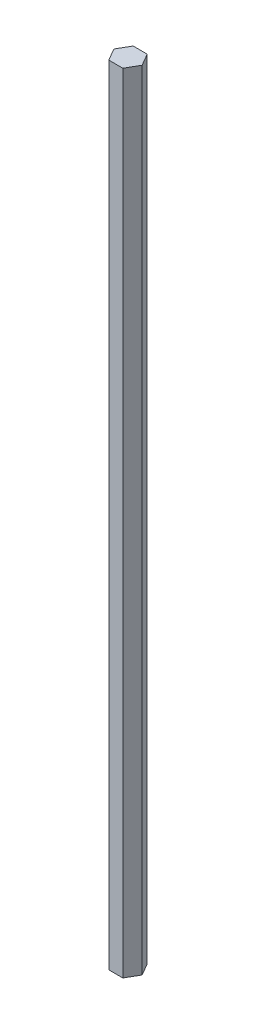
ISO-10303-21;
HEADER;
FILE_DESCRIPTION(('STEP AP214'),'2;1');
FILE_NAME('part.step','',(''),(''),'','','');
FILE_SCHEMA(('AUTOMOTIVE_DESIGN { 1 0 10303 214 1 1 1 1 }'));
ENDSEC;
DATA;
#1=APPLICATION_CONTEXT('core data for automotive mechanical design processes');
#2=APPLICATION_PROTOCOL_DEFINITION('international standard','automotive_design',2000,#1);
#3=PRODUCT_CONTEXT('',#1,'mechanical');
#4=PRODUCT('Part','Part','',(#3));
#5=PRODUCT_RELATED_PRODUCT_CATEGORY('part','',(#4));
#6=PRODUCT_DEFINITION_FORMATION('','',#4);
#7=PRODUCT_DEFINITION_CONTEXT('part definition',#1,'design');
#8=PRODUCT_DEFINITION('design','',#6,#7);
#9=PRODUCT_DEFINITION_SHAPE('','',#8);
#10=(LENGTH_UNIT() NAMED_UNIT(*) SI_UNIT(.MILLI.,.METRE.));
#11=(NAMED_UNIT(*) PLANE_ANGLE_UNIT() SI_UNIT($,.RADIAN.));
#12=(NAMED_UNIT(*) SI_UNIT($,.STERADIAN.) SOLID_ANGLE_UNIT());
#13=UNCERTAINTY_MEASURE_WITH_UNIT(LENGTH_MEASURE(1.E-05),#10,'distance_accuracy_value','');
#14=(GEOMETRIC_REPRESENTATION_CONTEXT(3) GLOBAL_UNCERTAINTY_ASSIGNED_CONTEXT((#13)) GLOBAL_UNIT_ASSIGNED_CONTEXT((#10,
#11,#12)) REPRESENTATION_CONTEXT('',''));
#15=CARTESIAN_POINT('',(0.,0.,0.));
#16=DIRECTION('',(0.,0.,1.));
#17=DIRECTION('',(1.,0.,0.));
#18=AXIS2_PLACEMENT_3D('',#15,#16,#17);
#19=CARTESIAN_POINT('',(-3.66617420935412,410.464,6.35));
#20=DIRECTION('',(0.,0.,-1.));
#21=DIRECTION('',(-1.,0.,0.));
#22=AXIS2_PLACEMENT_3D('',#19,#20,#21);
#23=PLANE('',#22);
#24=DIRECTION('',(1.,0.,0.));
#25=VECTOR('',#24,1.);
#26=CARTESIAN_POINT('',(-3.66617420935412,0.,6.35));
#27=LINE('',#26,#25);
#28=CARTESIAN_POINT('',(-3.66617420935412,0.,6.35));
#29=VERTEX_POINT('',#28);
#30=CARTESIAN_POINT('',(3.66617420935412,0.,6.35));
#31=VERTEX_POINT('',#30);
#32=EDGE_CURVE('E130',#29,#31,#27,.T.);
#33=ORIENTED_EDGE('',*,*,#32,.T.);
#34=DIRECTION('',(0.,-1.,0.));
#35=VECTOR('',#34,1.);
#36=CARTESIAN_POINT('',(3.66617420935412,410.464,6.35));
#37=LINE('',#36,#35);
#38=CARTESIAN_POINT('',(3.66617420935412,410.464,6.35));
#39=VERTEX_POINT('',#38);
#40=EDGE_CURVE('E11',#39,#31,#37,.T.);
#41=ORIENTED_EDGE('',*,*,#40,.F.);
#42=DIRECTION('',(1.,0.,0.));
#43=VECTOR('',#42,1.);
#44=CARTESIAN_POINT('',(-3.66617420935412,410.464,6.35));
#45=LINE('',#44,#43);
#46=CARTESIAN_POINT('',(-3.66617420935412,410.464,6.35));
#47=VERTEX_POINT('',#46);
#48=EDGE_CURVE('E142',#47,#39,#45,.T.);
#49=ORIENTED_EDGE('',*,*,#48,.F.);
#50=DIRECTION('',(0.,-1.,0.));
#51=VECTOR('',#50,1.);
#52=CARTESIAN_POINT('',(-3.66617420935412,410.464,6.35));
#53=LINE('',#52,#51);
#54=EDGE_CURVE('E126',#47,#29,#53,.T.);
#55=ORIENTED_EDGE('',*,*,#54,.T.);
#56=EDGE_LOOP('',(#33,#41,#49,#55));
#57=FACE_BOUND('',#56,.T.);
#58=ADVANCED_FACE('F43',(#57),#23,.F.);
#59=CARTESIAN_POINT('',(3.66617420935412,410.464,6.35));
#60=DIRECTION('',(-0.866025403784439,0.,-0.5));
#61=DIRECTION('',(-0.5,0.,0.866025403784439));
#62=AXIS2_PLACEMENT_3D('',#59,#60,#61);
#63=PLANE('',#62);
#64=DIRECTION('',(0.5,0.,-0.866025403784439));
#65=VECTOR('',#64,1.);
#66=CARTESIAN_POINT('',(3.66617420935412,0.,6.35));
#67=LINE('',#66,#65);
#68=CARTESIAN_POINT('',(7.33234841870825,0.,0.));
#69=VERTEX_POINT('',#68);
#70=EDGE_CURVE('E133',#31,#69,#67,.T.);
#71=ORIENTED_EDGE('',*,*,#70,.T.);
#72=DIRECTION('',(0.,-1.,0.));
#73=VECTOR('',#72,1.);
#74=CARTESIAN_POINT('',(7.33234841870825,410.464,0.));
#75=LINE('',#74,#73);
#76=CARTESIAN_POINT('',(7.33234841870825,410.464,0.));
#77=VERTEX_POINT('',#76);
#78=EDGE_CURVE('E52',#77,#69,#75,.T.);
#79=ORIENTED_EDGE('',*,*,#78,.F.);
#80=DIRECTION('',(0.5,0.,-0.866025403784439));
#81=VECTOR('',#80,1.);
#82=CARTESIAN_POINT('',(3.66617420935412,410.464,6.35));
#83=LINE('',#82,#81);
#84=EDGE_CURVE('E98',#39,#77,#83,.T.);
#85=ORIENTED_EDGE('',*,*,#84,.F.);
#86=ORIENTED_EDGE('',*,*,#40,.T.);
#87=EDGE_LOOP('',(#71,#79,#85,#86));
#88=FACE_BOUND('',#87,.T.);
#89=ADVANCED_FACE('F170',(#88),#63,.F.);
#90=CARTESIAN_POINT('',(7.33234841870825,410.464,0.));
#91=DIRECTION('',(-0.866025403784439,0.,0.5));
#92=DIRECTION('',(0.5,0.,0.866025403784439));
#93=AXIS2_PLACEMENT_3D('',#90,#91,#92);
#94=PLANE('',#93);
#95=DIRECTION('',(-0.5,0.,-0.866025403784438));
#96=VECTOR('',#95,1.);
#97=CARTESIAN_POINT('',(7.33234841870825,0.,0.));
#98=LINE('',#97,#96);
#99=CARTESIAN_POINT('',(3.66617420935412,0.,-6.35));
#100=VERTEX_POINT('',#99);
#101=EDGE_CURVE('E135',#69,#100,#98,.T.);
#102=ORIENTED_EDGE('',*,*,#101,.T.);
#103=DIRECTION('',(0.,-1.,0.));
#104=VECTOR('',#103,1.);
#105=CARTESIAN_POINT('',(3.66617420935412,410.464,-6.35));
#106=LINE('',#105,#104);
#107=CARTESIAN_POINT('',(3.66617420935412,410.464,-6.35));
#108=VERTEX_POINT('',#107);
#109=EDGE_CURVE('E121',#108,#100,#106,.T.);
#110=ORIENTED_EDGE('',*,*,#109,.F.);
#111=DIRECTION('',(-0.5,0.,-0.866025403784438));
#112=VECTOR('',#111,1.);
#113=CARTESIAN_POINT('',(7.33234841870825,410.464,0.));
#114=LINE('',#113,#112);
#115=EDGE_CURVE('E111',#77,#108,#114,.T.);
#116=ORIENTED_EDGE('',*,*,#115,.F.);
#117=ORIENTED_EDGE('',*,*,#78,.T.);
#118=EDGE_LOOP('',(#102,#110,#116,#117));
#119=FACE_BOUND('',#118,.T.);
#120=ADVANCED_FACE('F152',(#119),#94,.F.);
#121=CARTESIAN_POINT('',(3.66617420935412,410.464,-6.35));
#122=DIRECTION('',(0.,0.,1.));
#123=DIRECTION('',(1.,0.,0.));
#124=AXIS2_PLACEMENT_3D('',#121,#122,#123);
#125=PLANE('',#124);
#126=DIRECTION('',(-1.,0.,0.));
#127=VECTOR('',#126,1.);
#128=CARTESIAN_POINT('',(3.66617420935412,0.,-6.35));
#129=LINE('',#128,#127);
#130=CARTESIAN_POINT('',(-3.66617420935412,0.,-6.35));
#131=VERTEX_POINT('',#130);
#132=EDGE_CURVE('E119',#100,#131,#129,.T.);
#133=ORIENTED_EDGE('',*,*,#132,.T.);
#134=DIRECTION('',(0.,-1.,0.));
#135=VECTOR('',#134,1.);
#136=CARTESIAN_POINT('',(-3.66617420935412,410.464,-6.35));
#137=LINE('',#136,#135);
#138=CARTESIAN_POINT('',(-3.66617420935412,410.464,-6.35));
#139=VERTEX_POINT('',#138);
#140=EDGE_CURVE('E116',#139,#131,#137,.T.);
#141=ORIENTED_EDGE('',*,*,#140,.F.);
#142=DIRECTION('',(-1.,0.,0.));
#143=VECTOR('',#142,1.);
#144=CARTESIAN_POINT('',(3.66617420935412,410.464,-6.35));
#145=LINE('',#144,#143);
#146=EDGE_CURVE('E105',#108,#139,#145,.T.);
#147=ORIENTED_EDGE('',*,*,#146,.F.);
#148=ORIENTED_EDGE('',*,*,#109,.T.);
#149=EDGE_LOOP('',(#133,#141,#147,#148));
#150=FACE_BOUND('',#149,.T.);
#151=ADVANCED_FACE('F117',(#150),#125,.F.);
#152=CARTESIAN_POINT('',(-3.66617420935412,410.464,-6.35));
#153=DIRECTION('',(0.866025403784439,0.,0.5));
#154=DIRECTION('',(0.5,0.,-0.866025403784439));
#155=AXIS2_PLACEMENT_3D('',#152,#153,#154);
#156=PLANE('',#155);
#157=DIRECTION('',(-0.5,0.,0.866025403784439));
#158=VECTOR('',#157,1.);
#159=CARTESIAN_POINT('',(-3.66617420935412,0.,-6.35));
#160=LINE('',#159,#158);
#161=CARTESIAN_POINT('',(-7.33234841870825,0.,0.));
#162=VERTEX_POINT('',#161);
#163=EDGE_CURVE('E84',#131,#162,#160,.T.);
#164=ORIENTED_EDGE('',*,*,#163,.T.);
#165=DIRECTION('',(0.,-1.,0.));
#166=VECTOR('',#165,1.);
#167=CARTESIAN_POINT('',(-7.33234841870825,410.464,0.));
#168=LINE('',#167,#166);
#169=CARTESIAN_POINT('',(-7.33234841870825,410.464,0.));
#170=VERTEX_POINT('',#169);
#171=EDGE_CURVE('E122',#170,#162,#168,.T.);
#172=ORIENTED_EDGE('',*,*,#171,.F.);
#173=DIRECTION('',(-0.5,0.,0.866025403784439));
#174=VECTOR('',#173,1.);
#175=CARTESIAN_POINT('',(-3.66617420935412,410.464,-6.35));
#176=LINE('',#175,#174);
#177=EDGE_CURVE('E109',#139,#170,#176,.T.);
#178=ORIENTED_EDGE('',*,*,#177,.F.);
#179=ORIENTED_EDGE('',*,*,#140,.T.);
#180=EDGE_LOOP('',(#164,#172,#178,#179));
#181=FACE_BOUND('',#180,.T.);
#182=ADVANCED_FACE('F124',(#181),#156,.F.);
#183=CARTESIAN_POINT('',(-7.33234841870825,410.464,0.));
#184=DIRECTION('',(0.866025403784439,0.,-0.5));
#185=DIRECTION('',(-0.5,0.,-0.866025403784439));
#186=AXIS2_PLACEMENT_3D('',#183,#184,#185);
#187=PLANE('',#186);
#188=DIRECTION('',(0.5,0.,0.866025403784439));
#189=VECTOR('',#188,1.);
#190=CARTESIAN_POINT('',(-7.33234841870825,0.,0.));
#191=LINE('',#190,#189);
#192=EDGE_CURVE('E90',#162,#29,#191,.T.);
#193=ORIENTED_EDGE('',*,*,#192,.T.);
#194=ORIENTED_EDGE('',*,*,#54,.F.);
#195=DIRECTION('',(0.5,0.,0.866025403784439));
#196=VECTOR('',#195,1.);
#197=CARTESIAN_POINT('',(-7.33234841870825,410.464,0.));
#198=LINE('',#197,#196);
#199=EDGE_CURVE('E60',#170,#47,#198,.T.);
#200=ORIENTED_EDGE('',*,*,#199,.F.);
#201=ORIENTED_EDGE('',*,*,#171,.T.);
#202=EDGE_LOOP('',(#193,#194,#200,#201));
#203=FACE_BOUND('',#202,.T.);
#204=ADVANCED_FACE('F159',(#203),#187,.F.);
#205=CARTESIAN_POINT('',(0.,410.464,0.));
#206=DIRECTION('',(0.,1.,0.));
#207=DIRECTION('',(0.,0.,1.));
#208=AXIS2_PLACEMENT_3D('',#205,#206,#207);
#209=PLANE('',#208);
#210=ORIENTED_EDGE('',*,*,#48,.T.);
#211=ORIENTED_EDGE('',*,*,#84,.T.);
#212=ORIENTED_EDGE('',*,*,#115,.T.);
#213=ORIENTED_EDGE('',*,*,#146,.T.);
#214=ORIENTED_EDGE('',*,*,#177,.T.);
#215=ORIENTED_EDGE('',*,*,#199,.T.);
#216=EDGE_LOOP('',(#210,#211,#212,#213,#214,#215));
#217=FACE_BOUND('',#216,.T.);
#218=ADVANCED_FACE('F107',(#217),#209,.T.);
#219=CARTESIAN_POINT('',(0.,0.,0.));
#220=DIRECTION('',(0.,1.,0.));
#221=DIRECTION('',(0.,0.,1.));
#222=AXIS2_PLACEMENT_3D('',#219,#220,#221);
#223=PLANE('',#222);
#224=ORIENTED_EDGE('',*,*,#32,.F.);
#225=ORIENTED_EDGE('',*,*,#192,.F.);
#226=ORIENTED_EDGE('',*,*,#163,.F.);
#227=ORIENTED_EDGE('',*,*,#132,.F.);
#228=ORIENTED_EDGE('',*,*,#101,.F.);
#229=ORIENTED_EDGE('',*,*,#70,.F.);
#230=EDGE_LOOP('',(#224,#225,#226,#227,#228,#229));
#231=FACE_BOUND('',#230,.T.);
#232=ADVANCED_FACE('F155',(#231),#223,.F.);
#233=CLOSED_SHELL('',(#58,#89,#120,#151,#182,#204,#218,#232));
#234=MANIFOLD_SOLID_BREP('B2',#233);
#235=ADVANCED_BREP_SHAPE_REPRESENTATION('',(#18,#234),#14);
#236=SHAPE_DEFINITION_REPRESENTATION(#9,#235);
ENDSEC;
END-ISO-10303-21;
